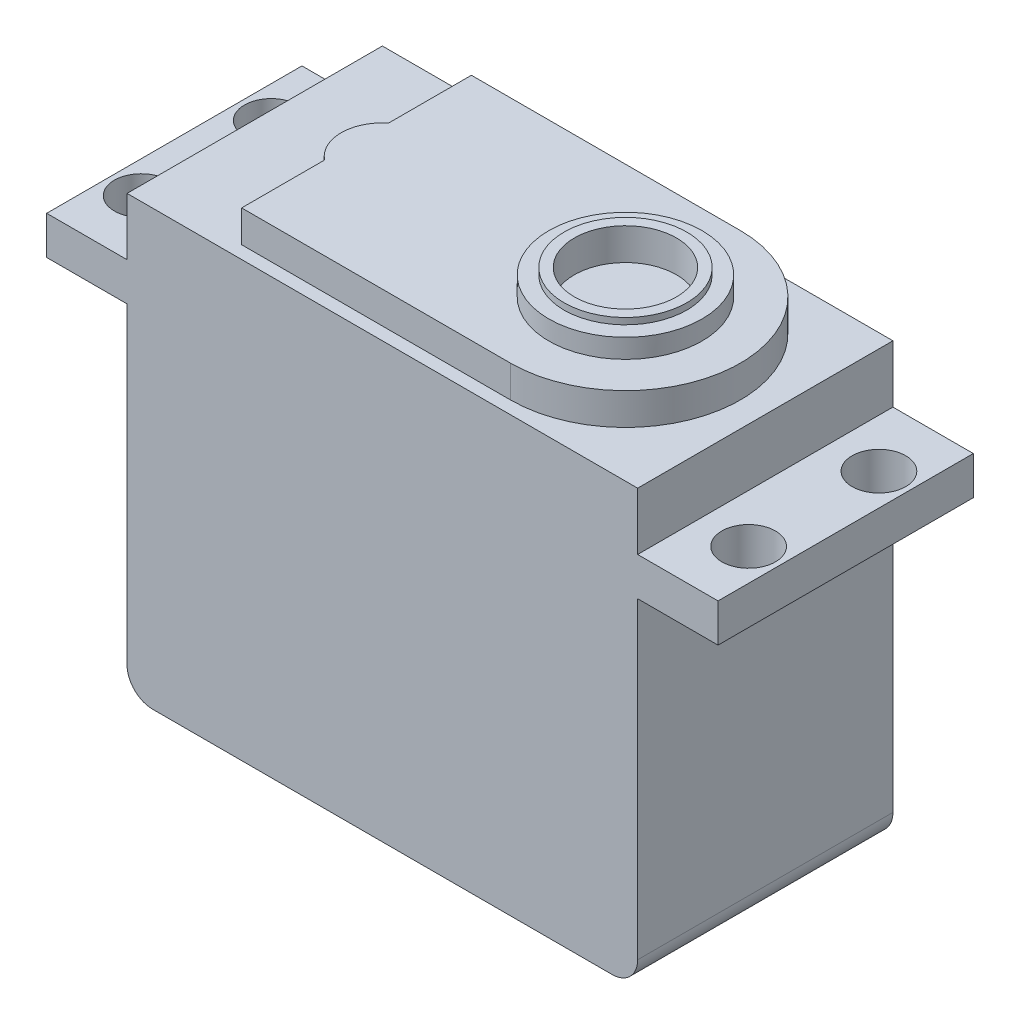
ISO-10303-21;
HEADER;
FILE_DESCRIPTION(('STEP AP214'),'2;1');
FILE_NAME('part.step','',(''),(''),'','','');
FILE_SCHEMA(('AUTOMOTIVE_DESIGN { 1 0 10303 214 1 1 1 1 }'));
ENDSEC;
DATA;
#1=APPLICATION_CONTEXT('core data for automotive mechanical design processes');
#2=APPLICATION_PROTOCOL_DEFINITION('international standard','automotive_design',2000,#1);
#3=PRODUCT_CONTEXT('',#1,'mechanical');
#4=PRODUCT('Part','Part','',(#3));
#5=PRODUCT_RELATED_PRODUCT_CATEGORY('part','',(#4));
#6=PRODUCT_DEFINITION_FORMATION('','',#4);
#7=PRODUCT_DEFINITION_CONTEXT('part definition',#1,'design');
#8=PRODUCT_DEFINITION('design','',#6,#7);
#9=PRODUCT_DEFINITION_SHAPE('','',#8);
#10=(LENGTH_UNIT() NAMED_UNIT(*) SI_UNIT(.MILLI.,.METRE.));
#11=(NAMED_UNIT(*) PLANE_ANGLE_UNIT() SI_UNIT($,.RADIAN.));
#12=(NAMED_UNIT(*) SI_UNIT($,.STERADIAN.) SOLID_ANGLE_UNIT());
#13=UNCERTAINTY_MEASURE_WITH_UNIT(LENGTH_MEASURE(1.E-05),#10,'distance_accuracy_value','');
#14=(GEOMETRIC_REPRESENTATION_CONTEXT(3) GLOBAL_UNCERTAINTY_ASSIGNED_CONTEXT((#13)) GLOBAL_UNIT_ASSIGNED_CONTEXT((#10,
#11,#12)) REPRESENTATION_CONTEXT('',''));
#15=CARTESIAN_POINT('',(0.,0.,0.));
#16=DIRECTION('',(0.,0.,1.));
#17=DIRECTION('',(1.,0.,0.));
#18=AXIS2_PLACEMENT_3D('',#15,#16,#17);
#19=CARTESIAN_POINT('',(-32.0271694650529,34.,18.9967501588768));
#20=DIRECTION('',(-1.,0.,0.));
#21=DIRECTION('',(0.,0.,1.));
#22=AXIS2_PLACEMENT_3D('',#19,#20,#21);
#23=PLANE('',#22);
#24=DIRECTION('',(0.,1.,0.));
#25=VECTOR('',#24,1.);
#26=CARTESIAN_POINT('',(-32.0271694650529,34.,12.5024903389481));
#27=LINE('',#26,#25);
#28=CARTESIAN_POINT('',(-32.0271694650529,34.,12.5024903389481));
#29=VERTEX_POINT('',#28);
#30=CARTESIAN_POINT('',(-32.0271694650529,36.5,12.5024903389481));
#31=VERTEX_POINT('',#30);
#32=EDGE_CURVE('E172',#29,#31,#27,.T.);
#33=ORIENTED_EDGE('',*,*,#32,.F.);
#34=DIRECTION('',(0.,0.,1.));
#35=VECTOR('',#34,1.);
#36=CARTESIAN_POINT('',(-32.0271694650529,34.,18.9967501588768));
#37=LINE('',#36,#35);
#38=CARTESIAN_POINT('',(-32.0271694650529,34.,18.9967501588768));
#39=VERTEX_POINT('',#38);
#40=EDGE_CURVE('E183',#29,#39,#37,.T.);
#41=ORIENTED_EDGE('',*,*,#40,.T.);
#42=DIRECTION('',(0.,1.,0.));
#43=VECTOR('',#42,1.);
#44=CARTESIAN_POINT('',(-32.0271694650529,34.,18.9967501588768));
#45=LINE('',#44,#43);
#46=CARTESIAN_POINT('',(-32.0271694650529,36.5,18.9967501588768));
#47=VERTEX_POINT('',#46);
#48=EDGE_CURVE('E204',#39,#47,#45,.T.);
#49=ORIENTED_EDGE('',*,*,#48,.T.);
#50=DIRECTION('',(0.,0.,1.));
#51=VECTOR('',#50,1.);
#52=CARTESIAN_POINT('',(-32.0271694650529,36.5,18.9967501588768));
#53=LINE('',#52,#51);
#54=EDGE_CURVE('E185',#31,#47,#53,.T.);
#55=ORIENTED_EDGE('',*,*,#54,.F.);
#56=EDGE_LOOP('',(#33,#41,#49,#55));
#57=FACE_BOUND('',#56,.T.);
#58=ADVANCED_FACE('F34',(#57),#23,.T.);
#59=CARTESIAN_POINT('',(-33.,36.5,20.));
#60=DIRECTION('',(0.,-1.,0.));
#61=DIRECTION('',(0.,0.,-1.));
#62=AXIS2_PLACEMENT_3D('',#59,#60,#61);
#63=PLANE('',#62);
#64=CARTESIAN_POINT('',(-10.9550056701124,36.5,10.));
#65=DIRECTION('',(0.,-1.,0.));
#66=DIRECTION('',(0.,0.,-1.));
#67=AXIS2_PLACEMENT_3D('',#64,#65,#66);
#68=CIRCLE('',#67,6.);
#69=CARTESIAN_POINT('',(-10.9550056701124,36.5,4.));
#70=VERTEX_POINT('',#69);
#71=EDGE_CURVE('E12',#70,#70,#68,.F.);
#72=ORIENTED_EDGE('',*,*,#71,.F.);
#73=EDGE_LOOP('',(#72));
#74=FACE_BOUND('',#73,.T.);
#75=CARTESIAN_POINT('',(-32.0271694650529,36.5,0.996258185239185));
#76=VERTEX_POINT('',#75);
#77=CARTESIAN_POINT('',(-32.0271694650529,36.5,7.49051800516791));
#78=VERTEX_POINT('',#77);
#79=EDGE_CURVE('E205',#76,#78,#53,.T.);
#80=ORIENTED_EDGE('',*,*,#79,.T.);
#81=CARTESIAN_POINT('',(-30.0193990532733,36.5,9.996504172058));
#82=DIRECTION('',(0.,1.,0.));
#83=DIRECTION('',(0.,0.,1.));
#84=AXIS2_PLACEMENT_3D('',#81,#82,#83);
#85=CIRCLE('',#84,3.21109151147425);
#86=EDGE_CURVE('E178',#78,#31,#85,.T.);
#87=ORIENTED_EDGE('',*,*,#86,.T.);
#88=ORIENTED_EDGE('',*,*,#54,.T.);
#89=DIRECTION('',(1.,0.,0.));
#90=VECTOR('',#89,1.);
#91=CARTESIAN_POINT('',(-32.0271694650529,36.5,18.9967501588768));
#92=LINE('',#91,#90);
#93=CARTESIAN_POINT('',(-10.9550056701124,36.5,18.9967501588768));
#94=VERTEX_POINT('',#93);
#95=EDGE_CURVE('E208',#47,#94,#92,.T.);
#96=ORIENTED_EDGE('',*,*,#95,.T.);
#97=CARTESIAN_POINT('',(-10.9550056701124,36.5,9.996504172058));
#98=DIRECTION('',(0.,1.,0.));
#99=DIRECTION('',(0.,0.,-1.));
#100=AXIS2_PLACEMENT_3D('',#97,#98,#99);
#101=CIRCLE('',#100,9.00024598681881);
#102=CARTESIAN_POINT('',(-10.9550056701124,36.5,0.996258185239185));
#103=VERTEX_POINT('',#102);
#104=EDGE_CURVE('E57',#94,#103,#101,.T.);
#105=ORIENTED_EDGE('',*,*,#104,.T.);
#106=DIRECTION('',(-1.,0.,0.));
#107=VECTOR('',#106,1.);
#108=CARTESIAN_POINT('',(-32.0271694650529,36.5,0.996258185239185));
#109=LINE('',#108,#107);
#110=EDGE_CURVE('E191',#103,#76,#109,.T.);
#111=ORIENTED_EDGE('',*,*,#110,.T.);
#112=EDGE_LOOP('',(#80,#87,#88,#96,#105,#111));
#113=FACE_BOUND('',#112,.T.);
#114=ADVANCED_FACE('F380',(#74,#113),#63,.F.);
#115=CARTESIAN_POINT('',(-10.9550056701124,38.,10.));
#116=DIRECTION('',(0.,1.,0.));
#117=DIRECTION('',(0.,0.,1.));
#118=AXIS2_PLACEMENT_3D('',#115,#116,#117);
#119=PLANE('',#118);
#120=CARTESIAN_POINT('',(-10.9550056701124,38.,10.));
#121=DIRECTION('',(0.,1.,0.));
#122=DIRECTION('',(0.,0.,1.));
#123=AXIS2_PLACEMENT_3D('',#120,#121,#122);
#124=CIRCLE('',#123,6.);
#125=CARTESIAN_POINT('',(-10.9550056701124,38.,16.));
#126=VERTEX_POINT('',#125);
#127=EDGE_CURVE('E232',#126,#126,#124,.T.);
#128=ORIENTED_EDGE('',*,*,#127,.T.);
#129=EDGE_LOOP('',(#128));
#130=FACE_BOUND('',#129,.T.);
#131=CARTESIAN_POINT('',(-10.9550056701124,38.,10.));
#132=DIRECTION('',(0.,1.,0.));
#133=DIRECTION('',(0.,0.,1.));
#134=AXIS2_PLACEMENT_3D('',#131,#132,#133);
#135=CIRCLE('',#134,4.80487124114227);
#136=CARTESIAN_POINT('',(-10.9550056701124,38.,14.8048712411423));
#137=VERTEX_POINT('',#136);
#138=EDGE_CURVE('E226',#137,#137,#135,.T.);
#139=ORIENTED_EDGE('',*,*,#138,.F.);
#140=EDGE_LOOP('',(#139));
#141=FACE_BOUND('',#140,.T.);
#142=ADVANCED_FACE('F386',(#130,#141),#119,.T.);
#143=CARTESIAN_POINT('',(-10.9550056701124,38.,10.));
#144=DIRECTION('',(0.,-1.,0.));
#145=DIRECTION('',(0.,0.,-1.));
#146=AXIS2_PLACEMENT_3D('',#143,#144,#145);
#147=CYLINDRICAL_SURFACE('',#146,6.);
#148=ORIENTED_EDGE('',*,*,#127,.F.);
#149=EDGE_LOOP('',(#148));
#150=FACE_BOUND('',#149,.T.);
#151=ORIENTED_EDGE('',*,*,#71,.T.);
#152=EDGE_LOOP('',(#151));
#153=FACE_BOUND('',#152,.T.);
#154=ADVANCED_FACE('F602',(#150,#153),#147,.T.);
#155=CARTESIAN_POINT('',(-10.9550056701124,38.5,10.));
#156=DIRECTION('',(0.,-1.,0.));
#157=DIRECTION('',(0.,0.,-1.));
#158=AXIS2_PLACEMENT_3D('',#155,#156,#157);
#159=CYLINDRICAL_SURFACE('',#158,4.80487124114227);
#160=CARTESIAN_POINT('',(-10.9550056701124,38.5,10.));
#161=DIRECTION('',(0.,1.,0.));
#162=DIRECTION('',(0.,0.,1.));
#163=AXIS2_PLACEMENT_3D('',#160,#161,#162);
#164=CIRCLE('',#163,4.80487124114227);
#165=CARTESIAN_POINT('',(-10.9550056701124,38.5,14.8048712411423));
#166=VERTEX_POINT('',#165);
#167=EDGE_CURVE('E229',#166,#166,#164,.T.);
#168=ORIENTED_EDGE('',*,*,#167,.F.);
#169=EDGE_LOOP('',(#168));
#170=FACE_BOUND('',#169,.T.);
#171=ORIENTED_EDGE('',*,*,#138,.T.);
#172=EDGE_LOOP('',(#171));
#173=FACE_BOUND('',#172,.T.);
#174=ADVANCED_FACE('F593',(#170,#173),#159,.T.);
#175=CARTESIAN_POINT('',(-10.9550056701124,38.5,10.));
#176=DIRECTION('',(0.,1.,0.));
#177=DIRECTION('',(0.,0.,1.));
#178=AXIS2_PLACEMENT_3D('',#175,#176,#177);
#179=PLANE('',#178);
#180=CARTESIAN_POINT('',(-10.9550056701124,38.5,10.));
#181=DIRECTION('',(0.,1.,0.));
#182=DIRECTION('',(0.,0.,1.));
#183=AXIS2_PLACEMENT_3D('',#180,#181,#182);
#184=CIRCLE('',#183,4.00264676639774);
#185=CARTESIAN_POINT('',(-10.9550056701124,38.5,14.0026467663977));
#186=VERTEX_POINT('',#185);
#187=EDGE_CURVE('E222',#186,#186,#184,.T.);
#188=ORIENTED_EDGE('',*,*,#187,.F.);
#189=EDGE_LOOP('',(#188));
#190=FACE_BOUND('',#189,.T.);
#191=ORIENTED_EDGE('',*,*,#167,.T.);
#192=EDGE_LOOP('',(#191));
#193=FACE_BOUND('',#192,.T.);
#194=ADVANCED_FACE('F584',(#190,#193),#179,.T.);
#195=CARTESIAN_POINT('',(-10.9550056701124,36.,10.));
#196=DIRECTION('',(0.,1.,0.));
#197=DIRECTION('',(0.,0.,1.));
#198=AXIS2_PLACEMENT_3D('',#195,#196,#197);
#199=CYLINDRICAL_SURFACE('',#198,4.00264676639774);
#200=CARTESIAN_POINT('',(-10.9550056701124,36.,10.));
#201=DIRECTION('',(0.,1.,0.));
#202=DIRECTION('',(0.,0.,1.));
#203=AXIS2_PLACEMENT_3D('',#200,#201,#202);
#204=CIRCLE('',#203,4.00264676639774);
#205=CARTESIAN_POINT('',(-10.9550056701124,36.,14.0026467663977));
#206=VERTEX_POINT('',#205);
#207=EDGE_CURVE('E223',#206,#206,#204,.T.);
#208=ORIENTED_EDGE('',*,*,#207,.F.);
#209=EDGE_LOOP('',(#208));
#210=FACE_BOUND('',#209,.T.);
#211=ORIENTED_EDGE('',*,*,#187,.T.);
#212=EDGE_LOOP('',(#211));
#213=FACE_BOUND('',#212,.T.);
#214=ADVANCED_FACE('F402',(#210,#213),#199,.F.);
#215=CARTESIAN_POINT('',(-10.9550056701124,36.,10.));
#216=DIRECTION('',(0.,1.,0.));
#217=DIRECTION('',(0.,0.,1.));
#218=AXIS2_PLACEMENT_3D('',#215,#216,#217);
#219=PLANE('',#218);
#220=ORIENTED_EDGE('',*,*,#207,.T.);
#221=EDGE_LOOP('',(#220));
#222=FACE_BOUND('',#221,.T.);
#223=ADVANCED_FACE('F393',(#222),#219,.T.);
#224=DIRECTION('',(0.,1.,0.));
#225=VECTOR('',#224,1.);
#226=CARTESIAN_POINT('',(-32.0271694650529,34.,7.49051800516791));
#227=LINE('',#226,#225);
#228=CARTESIAN_POINT('',(-32.0271694650529,34.,7.49051800516791));
#229=VERTEX_POINT('',#228);
#230=EDGE_CURVE('E49',#229,#78,#227,.T.);
#231=ORIENTED_EDGE('',*,*,#230,.T.);
#232=ORIENTED_EDGE('',*,*,#79,.F.);
#233=DIRECTION('',(0.,1.,0.));
#234=VECTOR('',#233,1.);
#235=CARTESIAN_POINT('',(-32.0271694650529,34.,0.996258185239185));
#236=LINE('',#235,#234);
#237=CARTESIAN_POINT('',(-32.0271694650529,34.,0.996258185239185));
#238=VERTEX_POINT('',#237);
#239=EDGE_CURVE('E212',#238,#76,#236,.T.);
#240=ORIENTED_EDGE('',*,*,#239,.F.);
#241=EDGE_CURVE('E190',#238,#229,#37,.T.);
#242=ORIENTED_EDGE('',*,*,#241,.T.);
#243=EDGE_LOOP('',(#231,#232,#240,#242));
#244=FACE_BOUND('',#243,.T.);
#245=ADVANCED_FACE('F382',(#244),#23,.T.);
#246=CARTESIAN_POINT('',(-32.0271694650529,34.,0.996258185239185));
#247=DIRECTION('',(0.,0.,-1.));
#248=DIRECTION('',(-1.,0.,0.));
#249=AXIS2_PLACEMENT_3D('',#246,#247,#248);
#250=PLANE('',#249);
#251=ORIENTED_EDGE('',*,*,#110,.F.);
#252=DIRECTION('',(0.,1.,0.));
#253=VECTOR('',#252,1.);
#254=CARTESIAN_POINT('',(-10.9550056701124,34.,0.996258185239185));
#255=LINE('',#254,#253);
#256=CARTESIAN_POINT('',(-10.9550056701124,34.,0.996258185239185));
#257=VERTEX_POINT('',#256);
#258=EDGE_CURVE('E215',#257,#103,#255,.T.);
#259=ORIENTED_EDGE('',*,*,#258,.F.);
#260=DIRECTION('',(-1.,0.,0.));
#261=VECTOR('',#260,1.);
#262=CARTESIAN_POINT('',(-32.0271694650529,34.,0.996258185239185));
#263=LINE('',#262,#261);
#264=EDGE_CURVE('E201',#257,#238,#263,.T.);
#265=ORIENTED_EDGE('',*,*,#264,.T.);
#266=ORIENTED_EDGE('',*,*,#239,.T.);
#267=EDGE_LOOP('',(#251,#259,#265,#266));
#268=FACE_BOUND('',#267,.T.);
#269=ADVANCED_FACE('F392',(#268),#250,.T.);
#270=CARTESIAN_POINT('',(-10.9550056701124,34.,9.996504172058));
#271=DIRECTION('',(0.,1.,0.));
#272=DIRECTION('',(0.,0.,1.));
#273=AXIS2_PLACEMENT_3D('',#270,#271,#272);
#274=CYLINDRICAL_SURFACE('',#273,9.00024598681881);
#275=ORIENTED_EDGE('',*,*,#104,.F.);
#276=DIRECTION('',(0.,1.,0.));
#277=VECTOR('',#276,1.);
#278=CARTESIAN_POINT('',(-10.9550056701124,34.,18.9967501588768));
#279=LINE('',#278,#277);
#280=CARTESIAN_POINT('',(-10.9550056701124,34.,18.9967501588768));
#281=VERTEX_POINT('',#280);
#282=EDGE_CURVE('E217',#281,#94,#279,.T.);
#283=ORIENTED_EDGE('',*,*,#282,.F.);
#284=CARTESIAN_POINT('',(-10.9550056701124,34.,9.996504172058));
#285=DIRECTION('',(0.,1.,0.));
#286=DIRECTION('',(0.,0.,-1.));
#287=AXIS2_PLACEMENT_3D('',#284,#285,#286);
#288=CIRCLE('',#287,9.00024598681881);
#289=EDGE_CURVE('E198',#281,#257,#288,.T.);
#290=ORIENTED_EDGE('',*,*,#289,.T.);
#291=ORIENTED_EDGE('',*,*,#258,.T.);
#292=EDGE_LOOP('',(#275,#283,#290,#291));
#293=FACE_BOUND('',#292,.T.);
#294=ADVANCED_FACE('F399',(#293),#274,.T.);
#295=CARTESIAN_POINT('',(-32.0271694650529,34.,18.9967501588768));
#296=DIRECTION('',(0.,0.,1.));
#297=DIRECTION('',(1.,0.,0.));
#298=AXIS2_PLACEMENT_3D('',#295,#296,#297);
#299=PLANE('',#298);
#300=ORIENTED_EDGE('',*,*,#95,.F.);
#301=ORIENTED_EDGE('',*,*,#48,.F.);
#302=DIRECTION('',(1.,0.,0.));
#303=VECTOR('',#302,1.);
#304=CARTESIAN_POINT('',(-32.0271694650529,34.,18.9967501588768));
#305=LINE('',#304,#303);
#306=EDGE_CURVE('E189',#39,#281,#305,.T.);
#307=ORIENTED_EDGE('',*,*,#306,.T.);
#308=ORIENTED_EDGE('',*,*,#282,.T.);
#309=EDGE_LOOP('',(#300,#301,#307,#308));
#310=FACE_BOUND('',#309,.T.);
#311=ADVANCED_FACE('F375',(#310),#299,.T.);
#312=CARTESIAN_POINT('',(-43.7998593573354,9.49999999999999,15.0986945505736));
#313=DIRECTION('',(0.,1.,0.));
#314=DIRECTION('',(0.,0.,1.));
#315=AXIS2_PLACEMENT_3D('',#312,#313,#314);
#316=CYLINDRICAL_SURFACE('',#315,2.0980176883497);
#317=CARTESIAN_POINT('',(-43.7998593573354,29.5,15.0986945505736));
#318=DIRECTION('',(0.,1.,0.));
#319=DIRECTION('',(0.,0.,1.));
#320=AXIS2_PLACEMENT_3D('',#317,#318,#319);
#321=CIRCLE('',#320,2.0980176883497);
#322=CARTESIAN_POINT('',(-43.7998593573354,29.5,17.1967122389233));
#323=VERTEX_POINT('',#322);
#324=EDGE_CURVE('E241',#323,#323,#321,.T.);
#325=ORIENTED_EDGE('',*,*,#324,.T.);
#326=EDGE_LOOP('',(#325));
#327=FACE_BOUND('',#326,.T.);
#328=CARTESIAN_POINT('',(-43.7998593573354,26.5,15.0986945505736));
#329=DIRECTION('',(0.,1.,0.));
#330=DIRECTION('',(0.,0.,1.));
#331=AXIS2_PLACEMENT_3D('',#328,#329,#330);
#332=CIRCLE('',#331,2.0980176883497);
#333=CARTESIAN_POINT('',(-43.7998593573354,26.5,17.1967122389233));
#334=VERTEX_POINT('',#333);
#335=EDGE_CURVE('E244',#334,#334,#332,.T.);
#336=ORIENTED_EDGE('',*,*,#335,.F.);
#337=EDGE_LOOP('',(#336));
#338=FACE_BOUND('',#337,.T.);
#339=ADVANCED_FACE('F365',(#327,#338),#316,.F.);
#340=CARTESIAN_POINT('',(-43.7998593573354,9.49999999999999,4.90332743513022));
#341=DIRECTION('',(0.,1.,0.));
#342=DIRECTION('',(0.,0.,1.));
#343=AXIS2_PLACEMENT_3D('',#340,#341,#342);
#344=CYLINDRICAL_SURFACE('',#343,2.100740659958);
#345=CARTESIAN_POINT('',(-43.7998593573354,29.5,4.90332743513022));
#346=DIRECTION('',(0.,1.,0.));
#347=DIRECTION('',(0.,0.,1.));
#348=AXIS2_PLACEMENT_3D('',#345,#346,#347);
#349=CIRCLE('',#348,2.100740659958);
#350=CARTESIAN_POINT('',(-43.7998593573354,29.5,7.00406809508822));
#351=VERTEX_POINT('',#350);
#352=EDGE_CURVE('E237',#351,#351,#349,.T.);
#353=ORIENTED_EDGE('',*,*,#352,.T.);
#354=EDGE_LOOP('',(#353));
#355=FACE_BOUND('',#354,.T.);
#356=CARTESIAN_POINT('',(-43.7998593573354,26.5,4.90332743513022));
#357=DIRECTION('',(0.,1.,0.));
#358=DIRECTION('',(0.,0.,1.));
#359=AXIS2_PLACEMENT_3D('',#356,#357,#358);
#360=CIRCLE('',#359,2.100740659958);
#361=CARTESIAN_POINT('',(-43.7998593573354,26.5,7.00406809508822));
#362=VERTEX_POINT('',#361);
#363=EDGE_CURVE('E240',#362,#362,#360,.T.);
#364=ORIENTED_EDGE('',*,*,#363,.F.);
#365=EDGE_LOOP('',(#364));
#366=FACE_BOUND('',#365,.T.);
#367=ADVANCED_FACE('F362',(#355,#366),#344,.F.);
#368=CARTESIAN_POINT('',(3.8,9.49999999999999,15.1033868603889));
#369=DIRECTION('',(0.,1.,0.));
#370=DIRECTION('',(0.,0.,1.));
#371=AXIS2_PLACEMENT_3D('',#368,#369,#370);
#372=CYLINDRICAL_SURFACE('',#371,2.1);
#373=CARTESIAN_POINT('',(3.8,29.5,15.1033868603889));
#374=DIRECTION('',(0.,1.,0.));
#375=DIRECTION('',(0.,0.,1.));
#376=AXIS2_PLACEMENT_3D('',#373,#374,#375);
#377=CIRCLE('',#376,2.1);
#378=CARTESIAN_POINT('',(3.8,29.5,17.2033868603889));
#379=VERTEX_POINT('',#378);
#380=EDGE_CURVE('E251',#379,#379,#377,.T.);
#381=ORIENTED_EDGE('',*,*,#380,.T.);
#382=EDGE_LOOP('',(#381));
#383=FACE_BOUND('',#382,.T.);
#384=CARTESIAN_POINT('',(3.8,26.5,15.1033868603889));
#385=DIRECTION('',(0.,1.,0.));
#386=DIRECTION('',(0.,0.,1.));
#387=AXIS2_PLACEMENT_3D('',#384,#385,#386);
#388=CIRCLE('',#387,2.1);
#389=CARTESIAN_POINT('',(3.8,26.5,17.2033868603889));
#390=VERTEX_POINT('',#389);
#391=EDGE_CURVE('E254',#390,#390,#388,.T.);
#392=ORIENTED_EDGE('',*,*,#391,.F.);
#393=EDGE_LOOP('',(#392));
#394=FACE_BOUND('',#393,.T.);
#395=ADVANCED_FACE('F364',(#383,#394),#372,.F.);
#396=CARTESIAN_POINT('',(3.8,9.49999999999999,4.89659997352021));
#397=DIRECTION('',(0.,1.,0.));
#398=DIRECTION('',(0.,0.,1.));
#399=AXIS2_PLACEMENT_3D('',#396,#397,#398);
#400=CYLINDRICAL_SURFACE('',#399,2.1);
#401=CARTESIAN_POINT('',(3.8,29.5,4.89659997352021));
#402=DIRECTION('',(0.,1.,0.));
#403=DIRECTION('',(0.,0.,1.));
#404=AXIS2_PLACEMENT_3D('',#401,#402,#403);
#405=CIRCLE('',#404,2.1);
#406=CARTESIAN_POINT('',(3.8,29.5,6.99659997352021));
#407=VERTEX_POINT('',#406);
#408=EDGE_CURVE('E245',#407,#407,#405,.T.);
#409=ORIENTED_EDGE('',*,*,#408,.T.);
#410=EDGE_LOOP('',(#409));
#411=FACE_BOUND('',#410,.T.);
#412=CARTESIAN_POINT('',(3.8,26.5,4.89659997352021));
#413=DIRECTION('',(0.,1.,0.));
#414=DIRECTION('',(0.,0.,1.));
#415=AXIS2_PLACEMENT_3D('',#412,#413,#414);
#416=CIRCLE('',#415,2.1);
#417=CARTESIAN_POINT('',(3.8,26.5,6.99659997352021));
#418=VERTEX_POINT('',#417);
#419=EDGE_CURVE('E248',#418,#418,#416,.T.);
#420=ORIENTED_EDGE('',*,*,#419,.F.);
#421=EDGE_LOOP('',(#420));
#422=FACE_BOUND('',#421,.T.);
#423=ADVANCED_FACE('F372',(#411,#422),#400,.F.);
#424=CARTESIAN_POINT('',(-40.,29.5,20.));
#425=DIRECTION('',(1.,0.,0.));
#426=DIRECTION('',(0.,0.,-1.));
#427=AXIS2_PLACEMENT_3D('',#424,#425,#426);
#428=PLANE('',#427);
#429=DIRECTION('',(0.,-1.,0.));
#430=VECTOR('',#429,1.);
#431=CARTESIAN_POINT('',(-40.,29.5,0.));
#432=LINE('',#431,#430);
#433=CARTESIAN_POINT('',(-40.,34.,0.));
#434=VERTEX_POINT('',#433);
#435=CARTESIAN_POINT('',(-40.,29.5,0.));
#436=VERTEX_POINT('',#435);
#437=EDGE_CURVE('E292',#434,#436,#432,.T.);
#438=ORIENTED_EDGE('',*,*,#437,.T.);
#439=DIRECTION('',(0.,0.,-1.));
#440=VECTOR('',#439,1.);
#441=CARTESIAN_POINT('',(-40.,29.5,20.));
#442=LINE('',#441,#440);
#443=CARTESIAN_POINT('',(-40.,29.5,20.));
#444=VERTEX_POINT('',#443);
#445=EDGE_CURVE('E350',#444,#436,#442,.T.);
#446=ORIENTED_EDGE('',*,*,#445,.F.);
#447=DIRECTION('',(0.,-1.,0.));
#448=VECTOR('',#447,1.);
#449=CARTESIAN_POINT('',(-40.,29.5,20.));
#450=LINE('',#449,#448);
#451=CARTESIAN_POINT('',(-40.,34.,20.));
#452=VERTEX_POINT('',#451);
#453=EDGE_CURVE('E261',#452,#444,#450,.T.);
#454=ORIENTED_EDGE('',*,*,#453,.F.);
#455=DIRECTION('',(0.,0.,-1.));
#456=VECTOR('',#455,1.);
#457=CARTESIAN_POINT('',(-40.,34.,20.));
#458=LINE('',#457,#456);
#459=EDGE_CURVE('E42',#452,#434,#458,.T.);
#460=ORIENTED_EDGE('',*,*,#459,.T.);
#461=EDGE_LOOP('',(#438,#446,#454,#460));
#462=FACE_BOUND('',#461,.T.);
#463=ADVANCED_FACE('F472',(#462),#428,.F.);
#464=CARTESIAN_POINT('',(-46.3,29.5,20.));
#465=DIRECTION('',(0.,-1.,0.));
#466=DIRECTION('',(0.,0.,-1.));
#467=AXIS2_PLACEMENT_3D('',#464,#465,#466);
#468=PLANE('',#467);
#469=ORIENTED_EDGE('',*,*,#352,.F.);
#470=EDGE_LOOP('',(#469));
#471=FACE_BOUND('',#470,.T.);
#472=ORIENTED_EDGE('',*,*,#324,.F.);
#473=EDGE_LOOP('',(#472));
#474=FACE_BOUND('',#473,.T.);
#475=DIRECTION('',(-1.,0.,0.));
#476=VECTOR('',#475,1.);
#477=CARTESIAN_POINT('',(-46.3,29.5,0.));
#478=LINE('',#477,#476);
#479=CARTESIAN_POINT('',(-46.3,29.5,0.));
#480=VERTEX_POINT('',#479);
#481=EDGE_CURVE('E294',#436,#480,#478,.T.);
#482=ORIENTED_EDGE('',*,*,#481,.T.);
#483=DIRECTION('',(0.,0.,-1.));
#484=VECTOR('',#483,1.);
#485=CARTESIAN_POINT('',(-46.3,29.5,20.));
#486=LINE('',#485,#484);
#487=CARTESIAN_POINT('',(-46.3,29.5,20.));
#488=VERTEX_POINT('',#487);
#489=EDGE_CURVE('E347',#488,#480,#486,.T.);
#490=ORIENTED_EDGE('',*,*,#489,.F.);
#491=DIRECTION('',(-1.,0.,0.));
#492=VECTOR('',#491,1.);
#493=CARTESIAN_POINT('',(-46.3,29.5,20.));
#494=LINE('',#493,#492);
#495=EDGE_CURVE('E264',#444,#488,#494,.T.);
#496=ORIENTED_EDGE('',*,*,#495,.F.);
#497=ORIENTED_EDGE('',*,*,#445,.T.);
#498=EDGE_LOOP('',(#482,#490,#496,#497));
#499=FACE_BOUND('',#498,.T.);
#500=ADVANCED_FACE('F469',(#471,#474,#499),#468,.F.);
#501=CARTESIAN_POINT('',(-46.3,26.5,20.));
#502=DIRECTION('',(1.,0.,0.));
#503=DIRECTION('',(0.,0.,-1.));
#504=AXIS2_PLACEMENT_3D('',#501,#502,#503);
#505=PLANE('',#504);
#506=DIRECTION('',(0.,-1.,0.));
#507=VECTOR('',#506,1.);
#508=CARTESIAN_POINT('',(-46.3,26.5,0.));
#509=LINE('',#508,#507);
#510=CARTESIAN_POINT('',(-46.3,26.5,0.));
#511=VERTEX_POINT('',#510);
#512=EDGE_CURVE('E296',#480,#511,#509,.T.);
#513=ORIENTED_EDGE('',*,*,#512,.T.);
#514=DIRECTION('',(0.,0.,-1.));
#515=VECTOR('',#514,1.);
#516=CARTESIAN_POINT('',(-46.3,26.5,20.));
#517=LINE('',#516,#515);
#518=CARTESIAN_POINT('',(-46.3,26.5,20.));
#519=VERTEX_POINT('',#518);
#520=EDGE_CURVE('E344',#519,#511,#517,.T.);
#521=ORIENTED_EDGE('',*,*,#520,.F.);
#522=DIRECTION('',(0.,-1.,0.));
#523=VECTOR('',#522,1.);
#524=CARTESIAN_POINT('',(-46.3,26.5,20.));
#525=LINE('',#524,#523);
#526=EDGE_CURVE('E266',#488,#519,#525,.T.);
#527=ORIENTED_EDGE('',*,*,#526,.F.);
#528=ORIENTED_EDGE('',*,*,#489,.T.);
#529=EDGE_LOOP('',(#513,#521,#527,#528));
#530=FACE_BOUND('',#529,.T.);
#531=ADVANCED_FACE('F466',(#530),#505,.F.);
#532=CARTESIAN_POINT('',(-40.,26.5,20.));
#533=DIRECTION('',(0.,1.,0.));
#534=DIRECTION('',(0.,0.,1.));
#535=AXIS2_PLACEMENT_3D('',#532,#533,#534);
#536=PLANE('',#535);
#537=ORIENTED_EDGE('',*,*,#363,.T.);
#538=EDGE_LOOP('',(#537));
#539=FACE_BOUND('',#538,.T.);
#540=ORIENTED_EDGE('',*,*,#335,.T.);
#541=EDGE_LOOP('',(#540));
#542=FACE_BOUND('',#541,.T.);
#543=DIRECTION('',(1.,0.,0.));
#544=VECTOR('',#543,1.);
#545=CARTESIAN_POINT('',(-40.,26.5,0.));
#546=LINE('',#545,#544);
#547=CARTESIAN_POINT('',(-40.,26.5,0.));
#548=VERTEX_POINT('',#547);
#549=EDGE_CURVE('E298',#511,#548,#546,.T.);
#550=ORIENTED_EDGE('',*,*,#549,.T.);
#551=DIRECTION('',(0.,0.,-1.));
#552=VECTOR('',#551,1.);
#553=CARTESIAN_POINT('',(-40.,26.5,20.));
#554=LINE('',#553,#552);
#555=CARTESIAN_POINT('',(-40.,26.5,20.));
#556=VERTEX_POINT('',#555);
#557=EDGE_CURVE('E341',#556,#548,#554,.T.);
#558=ORIENTED_EDGE('',*,*,#557,.F.);
#559=DIRECTION('',(1.,0.,0.));
#560=VECTOR('',#559,1.);
#561=CARTESIAN_POINT('',(-40.,26.5,20.));
#562=LINE('',#561,#560);
#563=EDGE_CURVE('E268',#519,#556,#562,.T.);
#564=ORIENTED_EDGE('',*,*,#563,.F.);
#565=ORIENTED_EDGE('',*,*,#520,.T.);
#566=EDGE_LOOP('',(#550,#558,#564,#565));
#567=FACE_BOUND('',#566,.T.);
#568=ADVANCED_FACE('F359',(#539,#542,#567),#536,.F.);
#569=CARTESIAN_POINT('',(-40.,2.00000000000001,20.));
#570=DIRECTION('',(1.,0.,0.));
#571=DIRECTION('',(0.,0.,-1.));
#572=AXIS2_PLACEMENT_3D('',#569,#570,#571);
#573=PLANE('',#572);
#574=DIRECTION('',(0.,-1.,0.));
#575=VECTOR('',#574,1.);
#576=CARTESIAN_POINT('',(-40.,2.00000000000001,0.));
#577=LINE('',#576,#575);
#578=CARTESIAN_POINT('',(-40.,2.00000000000001,0.));
#579=VERTEX_POINT('',#578);
#580=EDGE_CURVE('E300',#548,#579,#577,.T.);
#581=ORIENTED_EDGE('',*,*,#580,.T.);
#582=DIRECTION('',(0.,0.,-1.));
#583=VECTOR('',#582,1.);
#584=CARTESIAN_POINT('',(-40.,2.00000000000001,20.));
#585=LINE('',#584,#583);
#586=CARTESIAN_POINT('',(-40.,2.00000000000001,20.));
#587=VERTEX_POINT('',#586);
#588=EDGE_CURVE('E338',#587,#579,#585,.T.);
#589=ORIENTED_EDGE('',*,*,#588,.F.);
#590=DIRECTION('',(0.,-1.,0.));
#591=VECTOR('',#590,1.);
#592=CARTESIAN_POINT('',(-40.,2.00000000000001,20.));
#593=LINE('',#592,#591);
#594=EDGE_CURVE('E270',#556,#587,#593,.T.);
#595=ORIENTED_EDGE('',*,*,#594,.F.);
#596=ORIENTED_EDGE('',*,*,#557,.T.);
#597=EDGE_LOOP('',(#581,#589,#595,#596));
#598=FACE_BOUND('',#597,.T.);
#599=ADVANCED_FACE('F459',(#598),#573,.F.);
#600=CARTESIAN_POINT('',(-38.,2.,20.));
#601=DIRECTION('',(0.,0.,-1.));
#602=DIRECTION('',(-1.,0.,0.));
#603=AXIS2_PLACEMENT_3D('',#600,#601,#602);
#604=CYLINDRICAL_SURFACE('',#603,2.);
#605=CARTESIAN_POINT('',(-38.,2.,0.));
#606=DIRECTION('',(0.,0.,1.));
#607=DIRECTION('',(1.,0.,0.));
#608=AXIS2_PLACEMENT_3D('',#605,#606,#607);
#609=CIRCLE('',#608,2.);
#610=CARTESIAN_POINT('',(-38.,0.,0.));
#611=VERTEX_POINT('',#610);
#612=EDGE_CURVE('E302',#579,#611,#609,.T.);
#613=ORIENTED_EDGE('',*,*,#612,.T.);
#614=DIRECTION('',(0.,0.,-1.));
#615=VECTOR('',#614,1.);
#616=CARTESIAN_POINT('',(-38.,0.,20.));
#617=LINE('',#616,#615);
#618=CARTESIAN_POINT('',(-38.,0.,20.));
#619=VERTEX_POINT('',#618);
#620=EDGE_CURVE('E335',#619,#611,#617,.T.);
#621=ORIENTED_EDGE('',*,*,#620,.F.);
#622=CARTESIAN_POINT('',(-38.,2.,20.));
#623=DIRECTION('',(0.,0.,1.));
#624=DIRECTION('',(1.,0.,0.));
#625=AXIS2_PLACEMENT_3D('',#622,#623,#624);
#626=CIRCLE('',#625,2.);
#627=EDGE_CURVE('E272',#587,#619,#626,.T.);
#628=ORIENTED_EDGE('',*,*,#627,.F.);
#629=ORIENTED_EDGE('',*,*,#588,.T.);
#630=EDGE_LOOP('',(#613,#621,#628,#629));
#631=FACE_BOUND('',#630,.T.);
#632=ADVANCED_FACE('F455',(#631),#604,.T.);
#633=CARTESIAN_POINT('',(-2.00000000000001,0.,20.));
#634=DIRECTION('',(0.,1.,0.));
#635=DIRECTION('',(-1.,0.,0.));
#636=AXIS2_PLACEMENT_3D('',#633,#634,#635);
#637=PLANE('',#636);
#638=DIRECTION('',(1.,0.,0.));
#639=VECTOR('',#638,1.);
#640=CARTESIAN_POINT('',(-2.00000000000001,0.,0.));
#641=LINE('',#640,#639);
#642=CARTESIAN_POINT('',(-2.00000000000001,0.,0.));
#643=VERTEX_POINT('',#642);
#644=EDGE_CURVE('E304',#611,#643,#641,.T.);
#645=ORIENTED_EDGE('',*,*,#644,.T.);
#646=DIRECTION('',(0.,0.,-1.));
#647=VECTOR('',#646,1.);
#648=CARTESIAN_POINT('',(-2.00000000000001,0.,20.));
#649=LINE('',#648,#647);
#650=CARTESIAN_POINT('',(-2.00000000000001,0.,20.));
#651=VERTEX_POINT('',#650);
#652=EDGE_CURVE('E332',#651,#643,#649,.T.);
#653=ORIENTED_EDGE('',*,*,#652,.F.);
#654=DIRECTION('',(1.,0.,0.));
#655=VECTOR('',#654,1.);
#656=CARTESIAN_POINT('',(-2.00000000000001,0.,20.));
#657=LINE('',#656,#655);
#658=EDGE_CURVE('E274',#619,#651,#657,.T.);
#659=ORIENTED_EDGE('',*,*,#658,.F.);
#660=ORIENTED_EDGE('',*,*,#620,.T.);
#661=EDGE_LOOP('',(#645,#653,#659,#660));
#662=FACE_BOUND('',#661,.T.);
#663=ADVANCED_FACE('F451',(#662),#637,.F.);
#664=CARTESIAN_POINT('',(-2.,2.,20.));
#665=DIRECTION('',(0.,0.,-1.));
#666=DIRECTION('',(-1.,0.,0.));
#667=AXIS2_PLACEMENT_3D('',#664,#665,#666);
#668=CYLINDRICAL_SURFACE('',#667,2.);
#669=CARTESIAN_POINT('',(-2.,2.,0.));
#670=DIRECTION('',(0.,0.,1.));
#671=DIRECTION('',(-1.,0.,0.));
#672=AXIS2_PLACEMENT_3D('',#669,#670,#671);
#673=CIRCLE('',#672,2.);
#674=CARTESIAN_POINT('',(0.,2.00000000000001,0.));
#675=VERTEX_POINT('',#674);
#676=EDGE_CURVE('E306',#643,#675,#673,.T.);
#677=ORIENTED_EDGE('',*,*,#676,.T.);
#678=DIRECTION('',(0.,0.,-1.));
#679=VECTOR('',#678,1.);
#680=CARTESIAN_POINT('',(0.,2.00000000000001,20.));
#681=LINE('',#680,#679);
#682=CARTESIAN_POINT('',(0.,2.00000000000001,20.));
#683=VERTEX_POINT('',#682);
#684=EDGE_CURVE('E329',#683,#675,#681,.T.);
#685=ORIENTED_EDGE('',*,*,#684,.F.);
#686=CARTESIAN_POINT('',(-2.,2.,20.));
#687=DIRECTION('',(0.,0.,1.));
#688=DIRECTION('',(-1.,0.,0.));
#689=AXIS2_PLACEMENT_3D('',#686,#687,#688);
#690=CIRCLE('',#689,2.);
#691=EDGE_CURVE('E276',#651,#683,#690,.T.);
#692=ORIENTED_EDGE('',*,*,#691,.F.);
#693=ORIENTED_EDGE('',*,*,#652,.T.);
#694=EDGE_LOOP('',(#677,#685,#692,#693));
#695=FACE_BOUND('',#694,.T.);
#696=ADVANCED_FACE('F447',(#695),#668,.T.);
#697=CARTESIAN_POINT('',(0.,26.5,20.));
#698=DIRECTION('',(-1.,0.,0.));
#699=DIRECTION('',(0.,0.,1.));
#700=AXIS2_PLACEMENT_3D('',#697,#698,#699);
#701=PLANE('',#700);
#702=DIRECTION('',(0.,1.,0.));
#703=VECTOR('',#702,1.);
#704=CARTESIAN_POINT('',(0.,26.5,0.));
#705=LINE('',#704,#703);
#706=CARTESIAN_POINT('',(0.,26.5,0.));
#707=VERTEX_POINT('',#706);
#708=EDGE_CURVE('E308',#675,#707,#705,.T.);
#709=ORIENTED_EDGE('',*,*,#708,.T.);
#710=DIRECTION('',(0.,0.,-1.));
#711=VECTOR('',#710,1.);
#712=CARTESIAN_POINT('',(0.,26.5,20.));
#713=LINE('',#712,#711);
#714=CARTESIAN_POINT('',(0.,26.5,20.));
#715=VERTEX_POINT('',#714);
#716=EDGE_CURVE('E326',#715,#707,#713,.T.);
#717=ORIENTED_EDGE('',*,*,#716,.F.);
#718=DIRECTION('',(0.,1.,0.));
#719=VECTOR('',#718,1.);
#720=CARTESIAN_POINT('',(0.,26.5,20.));
#721=LINE('',#720,#719);
#722=EDGE_CURVE('E278',#683,#715,#721,.T.);
#723=ORIENTED_EDGE('',*,*,#722,.F.);
#724=ORIENTED_EDGE('',*,*,#684,.T.);
#725=EDGE_LOOP('',(#709,#717,#723,#724));
#726=FACE_BOUND('',#725,.T.);
#727=ADVANCED_FACE('F443',(#726),#701,.F.);
#728=CARTESIAN_POINT('',(6.3,26.5,20.));
#729=DIRECTION('',(0.,1.,0.));
#730=DIRECTION('',(0.,0.,1.));
#731=AXIS2_PLACEMENT_3D('',#728,#729,#730);
#732=PLANE('',#731);
#733=ORIENTED_EDGE('',*,*,#419,.T.);
#734=EDGE_LOOP('',(#733));
#735=FACE_BOUND('',#734,.T.);
#736=ORIENTED_EDGE('',*,*,#391,.T.);
#737=EDGE_LOOP('',(#736));
#738=FACE_BOUND('',#737,.T.);
#739=DIRECTION('',(1.,0.,0.));
#740=VECTOR('',#739,1.);
#741=CARTESIAN_POINT('',(6.3,26.5,0.));
#742=LINE('',#741,#740);
#743=CARTESIAN_POINT('',(6.3,26.5,0.));
#744=VERTEX_POINT('',#743);
#745=EDGE_CURVE('E310',#707,#744,#742,.T.);
#746=ORIENTED_EDGE('',*,*,#745,.T.);
#747=DIRECTION('',(0.,0.,-1.));
#748=VECTOR('',#747,1.);
#749=CARTESIAN_POINT('',(6.3,26.5,20.));
#750=LINE('',#749,#748);
#751=CARTESIAN_POINT('',(6.3,26.5,20.));
#752=VERTEX_POINT('',#751);
#753=EDGE_CURVE('E323',#752,#744,#750,.T.);
#754=ORIENTED_EDGE('',*,*,#753,.F.);
#755=DIRECTION('',(1.,0.,0.));
#756=VECTOR('',#755,1.);
#757=CARTESIAN_POINT('',(6.3,26.5,20.));
#758=LINE('',#757,#756);
#759=EDGE_CURVE('E280',#715,#752,#758,.T.);
#760=ORIENTED_EDGE('',*,*,#759,.F.);
#761=ORIENTED_EDGE('',*,*,#716,.T.);
#762=EDGE_LOOP('',(#746,#754,#760,#761));
#763=FACE_BOUND('',#762,.T.);
#764=ADVANCED_FACE('F439',(#735,#738,#763),#732,.F.);
#765=CARTESIAN_POINT('',(6.3,29.5,20.));
#766=DIRECTION('',(-1.,0.,0.));
#767=DIRECTION('',(0.,0.,1.));
#768=AXIS2_PLACEMENT_3D('',#765,#766,#767);
#769=PLANE('',#768);
#770=DIRECTION('',(0.,1.,0.));
#771=VECTOR('',#770,1.);
#772=CARTESIAN_POINT('',(6.3,29.5,0.));
#773=LINE('',#772,#771);
#774=CARTESIAN_POINT('',(6.3,29.5,0.));
#775=VERTEX_POINT('',#774);
#776=EDGE_CURVE('E312',#744,#775,#773,.T.);
#777=ORIENTED_EDGE('',*,*,#776,.T.);
#778=DIRECTION('',(0.,0.,-1.));
#779=VECTOR('',#778,1.);
#780=CARTESIAN_POINT('',(6.3,29.5,20.));
#781=LINE('',#780,#779);
#782=CARTESIAN_POINT('',(6.3,29.5,20.));
#783=VERTEX_POINT('',#782);
#784=EDGE_CURVE('E320',#783,#775,#781,.T.);
#785=ORIENTED_EDGE('',*,*,#784,.F.);
#786=DIRECTION('',(0.,1.,0.));
#787=VECTOR('',#786,1.);
#788=CARTESIAN_POINT('',(6.3,29.5,20.));
#789=LINE('',#788,#787);
#790=EDGE_CURVE('E282',#752,#783,#789,.T.);
#791=ORIENTED_EDGE('',*,*,#790,.F.);
#792=ORIENTED_EDGE('',*,*,#753,.T.);
#793=EDGE_LOOP('',(#777,#785,#791,#792));
#794=FACE_BOUND('',#793,.T.);
#795=ADVANCED_FACE('F435',(#794),#769,.F.);
#796=CARTESIAN_POINT('',(0.,29.5,20.));
#797=DIRECTION('',(0.,-1.,0.));
#798=DIRECTION('',(0.,0.,-1.));
#799=AXIS2_PLACEMENT_3D('',#796,#797,#798);
#800=PLANE('',#799);
#801=ORIENTED_EDGE('',*,*,#408,.F.);
#802=EDGE_LOOP('',(#801));
#803=FACE_BOUND('',#802,.T.);
#804=ORIENTED_EDGE('',*,*,#380,.F.);
#805=EDGE_LOOP('',(#804));
#806=FACE_BOUND('',#805,.T.);
#807=DIRECTION('',(-1.,0.,0.));
#808=VECTOR('',#807,1.);
#809=CARTESIAN_POINT('',(0.,29.5,0.));
#810=LINE('',#809,#808);
#811=CARTESIAN_POINT('',(0.,29.5,0.));
#812=VERTEX_POINT('',#811);
#813=EDGE_CURVE('E314',#775,#812,#810,.T.);
#814=ORIENTED_EDGE('',*,*,#813,.T.);
#815=DIRECTION('',(0.,0.,-1.));
#816=VECTOR('',#815,1.);
#817=CARTESIAN_POINT('',(0.,29.5,20.));
#818=LINE('',#817,#816);
#819=CARTESIAN_POINT('',(0.,29.5,20.));
#820=VERTEX_POINT('',#819);
#821=EDGE_CURVE('E289',#820,#812,#818,.T.);
#822=ORIENTED_EDGE('',*,*,#821,.F.);
#823=DIRECTION('',(-1.,0.,0.));
#824=VECTOR('',#823,1.);
#825=CARTESIAN_POINT('',(0.,29.5,20.));
#826=LINE('',#825,#824);
#827=EDGE_CURVE('E284',#783,#820,#826,.T.);
#828=ORIENTED_EDGE('',*,*,#827,.F.);
#829=ORIENTED_EDGE('',*,*,#784,.T.);
#830=EDGE_LOOP('',(#814,#822,#828,#829));
#831=FACE_BOUND('',#830,.T.);
#832=ADVANCED_FACE('F431',(#803,#806,#831),#800,.F.);
#833=CARTESIAN_POINT('',(-2.,2.,20.));
#834=DIRECTION('',(0.,0.,-1.));
#835=DIRECTION('',(-1.,0.,0.));
#836=AXIS2_PLACEMENT_3D('',#833,#834,#835);
#837=PLANE('',#836);
#838=DIRECTION('',(0.,1.,0.));
#839=VECTOR('',#838,1.);
#840=CARTESIAN_POINT('',(0.,36.5,20.));
#841=LINE('',#840,#839);
#842=CARTESIAN_POINT('',(0.,34.,20.));
#843=VERTEX_POINT('',#842);
#844=EDGE_CURVE('E286',#820,#843,#841,.T.);
#845=ORIENTED_EDGE('',*,*,#844,.T.);
#846=DIRECTION('',(-1.,0.,0.));
#847=VECTOR('',#846,1.);
#848=CARTESIAN_POINT('',(-40.,34.,20.));
#849=LINE('',#848,#847);
#850=EDGE_CURVE('E258',#843,#452,#849,.T.);
#851=ORIENTED_EDGE('',*,*,#850,.T.);
#852=ORIENTED_EDGE('',*,*,#453,.T.);
#853=ORIENTED_EDGE('',*,*,#495,.T.);
#854=ORIENTED_EDGE('',*,*,#526,.T.);
#855=ORIENTED_EDGE('',*,*,#563,.T.);
#856=ORIENTED_EDGE('',*,*,#594,.T.);
#857=ORIENTED_EDGE('',*,*,#627,.T.);
#858=ORIENTED_EDGE('',*,*,#658,.T.);
#859=ORIENTED_EDGE('',*,*,#691,.T.);
#860=ORIENTED_EDGE('',*,*,#722,.T.);
#861=ORIENTED_EDGE('',*,*,#759,.T.);
#862=ORIENTED_EDGE('',*,*,#790,.T.);
#863=ORIENTED_EDGE('',*,*,#827,.T.);
#864=EDGE_LOOP('',(#845,#851,#852,#853,#854,#855,#856,#857,#858,#859,#860,#861,#862,#863));
#865=FACE_BOUND('',#864,.T.);
#866=ADVANCED_FACE('F434',(#865),#837,.F.);
#867=CARTESIAN_POINT('',(-2.,2.,0.));
#868=DIRECTION('',(0.,0.,-1.));
#869=DIRECTION('',(-1.,0.,0.));
#870=AXIS2_PLACEMENT_3D('',#867,#868,#869);
#871=PLANE('',#870);
#872=DIRECTION('',(-1.,0.,0.));
#873=VECTOR('',#872,1.);
#874=CARTESIAN_POINT('',(-40.,34.,0.));
#875=LINE('',#874,#873);
#876=CARTESIAN_POINT('',(0.,34.,0.));
#877=VERTEX_POINT('',#876);
#878=EDGE_CURVE('E257',#877,#434,#875,.T.);
#879=ORIENTED_EDGE('',*,*,#878,.F.);
#880=DIRECTION('',(0.,1.,0.));
#881=VECTOR('',#880,1.);
#882=CARTESIAN_POINT('',(0.,36.5,0.));
#883=LINE('',#882,#881);
#884=EDGE_CURVE('E262',#812,#877,#883,.T.);
#885=ORIENTED_EDGE('',*,*,#884,.F.);
#886=ORIENTED_EDGE('',*,*,#813,.F.);
#887=ORIENTED_EDGE('',*,*,#776,.F.);
#888=ORIENTED_EDGE('',*,*,#745,.F.);
#889=ORIENTED_EDGE('',*,*,#708,.F.);
#890=ORIENTED_EDGE('',*,*,#676,.F.);
#891=ORIENTED_EDGE('',*,*,#644,.F.);
#892=ORIENTED_EDGE('',*,*,#612,.F.);
#893=ORIENTED_EDGE('',*,*,#580,.F.);
#894=ORIENTED_EDGE('',*,*,#549,.F.);
#895=ORIENTED_EDGE('',*,*,#512,.F.);
#896=ORIENTED_EDGE('',*,*,#481,.F.);
#897=ORIENTED_EDGE('',*,*,#437,.F.);
#898=EDGE_LOOP('',(#879,#885,#886,#887,#888,#889,#890,#891,#892,#893,#894,#895,#896,#897));
#899=FACE_BOUND('',#898,.T.);
#900=ADVANCED_FACE('F426',(#899),#871,.T.);
#901=CARTESIAN_POINT('',(-40.,34.,20.));
#902=DIRECTION('',(0.,-1.,0.));
#903=DIRECTION('',(0.,0.,-1.));
#904=AXIS2_PLACEMENT_3D('',#901,#902,#903);
#905=PLANE('',#904);
#906=ORIENTED_EDGE('',*,*,#878,.T.);
#907=ORIENTED_EDGE('',*,*,#459,.F.);
#908=ORIENTED_EDGE('',*,*,#850,.F.);
#909=DIRECTION('',(0.,0.,-1.));
#910=VECTOR('',#909,1.);
#911=CARTESIAN_POINT('',(0.,34.,20.));
#912=LINE('',#911,#910);
#913=EDGE_CURVE('E214',#843,#877,#912,.T.);
#914=ORIENTED_EDGE('',*,*,#913,.T.);
#915=EDGE_LOOP('',(#906,#907,#908,#914));
#916=FACE_BOUND('',#915,.T.);
#917=ORIENTED_EDGE('',*,*,#40,.F.);
#918=CARTESIAN_POINT('',(-30.0193990532733,34.,9.996504172058));
#919=DIRECTION('',(0.,-1.,0.));
#920=DIRECTION('',(0.,0.,-1.));
#921=AXIS2_PLACEMENT_3D('',#918,#919,#920);
#922=CIRCLE('',#921,3.21109151147425);
#923=EDGE_CURVE('E169',#29,#229,#922,.T.);
#924=ORIENTED_EDGE('',*,*,#923,.T.);
#925=ORIENTED_EDGE('',*,*,#241,.F.);
#926=ORIENTED_EDGE('',*,*,#264,.F.);
#927=ORIENTED_EDGE('',*,*,#289,.F.);
#928=ORIENTED_EDGE('',*,*,#306,.F.);
#929=EDGE_LOOP('',(#917,#924,#925,#926,#927,#928));
#930=FACE_BOUND('',#929,.T.);
#931=ADVANCED_FACE('F36',(#916,#930),#905,.F.);
#932=CARTESIAN_POINT('',(0.,36.5,20.));
#933=DIRECTION('',(-1.,0.,0.));
#934=DIRECTION('',(0.,0.,1.));
#935=AXIS2_PLACEMENT_3D('',#932,#933,#934);
#936=PLANE('',#935);
#937=ORIENTED_EDGE('',*,*,#913,.F.);
#938=ORIENTED_EDGE('',*,*,#844,.F.);
#939=ORIENTED_EDGE('',*,*,#821,.T.);
#940=ORIENTED_EDGE('',*,*,#884,.T.);
#941=EDGE_LOOP('',(#937,#938,#939,#940));
#942=FACE_BOUND('',#941,.T.);
#943=ADVANCED_FACE('F417',(#942),#936,.F.);
#944=CARTESIAN_POINT('',(-30.0193990532733,34.,9.996504172058));
#945=DIRECTION('',(0.,1.,0.));
#946=DIRECTION('',(0.,0.,1.));
#947=AXIS2_PLACEMENT_3D('',#944,#945,#946);
#948=CYLINDRICAL_SURFACE('',#947,3.21109151147425);
#949=ORIENTED_EDGE('',*,*,#86,.F.);
#950=ORIENTED_EDGE('',*,*,#230,.F.);
#951=ORIENTED_EDGE('',*,*,#923,.F.);
#952=ORIENTED_EDGE('',*,*,#32,.T.);
#953=EDGE_LOOP('',(#949,#950,#951,#952));
#954=FACE_BOUND('',#953,.T.);
#955=ADVANCED_FACE('F171',(#954),#948,.T.);
#956=CLOSED_SHELL('',(#58,#114,#142,#154,#174,#194,#214,#223,#245,#269,#294,#311,#339,#367,#395,
#423,#463,#500,#531,#568,#599,#632,#663,#696,#727,#764,#795,#832,#866,#900,#931,#943,#955));
#957=MANIFOLD_SOLID_BREP('B2',#956);
#958=ADVANCED_BREP_SHAPE_REPRESENTATION('',(#18,#957),#14);
#959=SHAPE_DEFINITION_REPRESENTATION(#9,#958);
ENDSEC;
END-ISO-10303-21;
